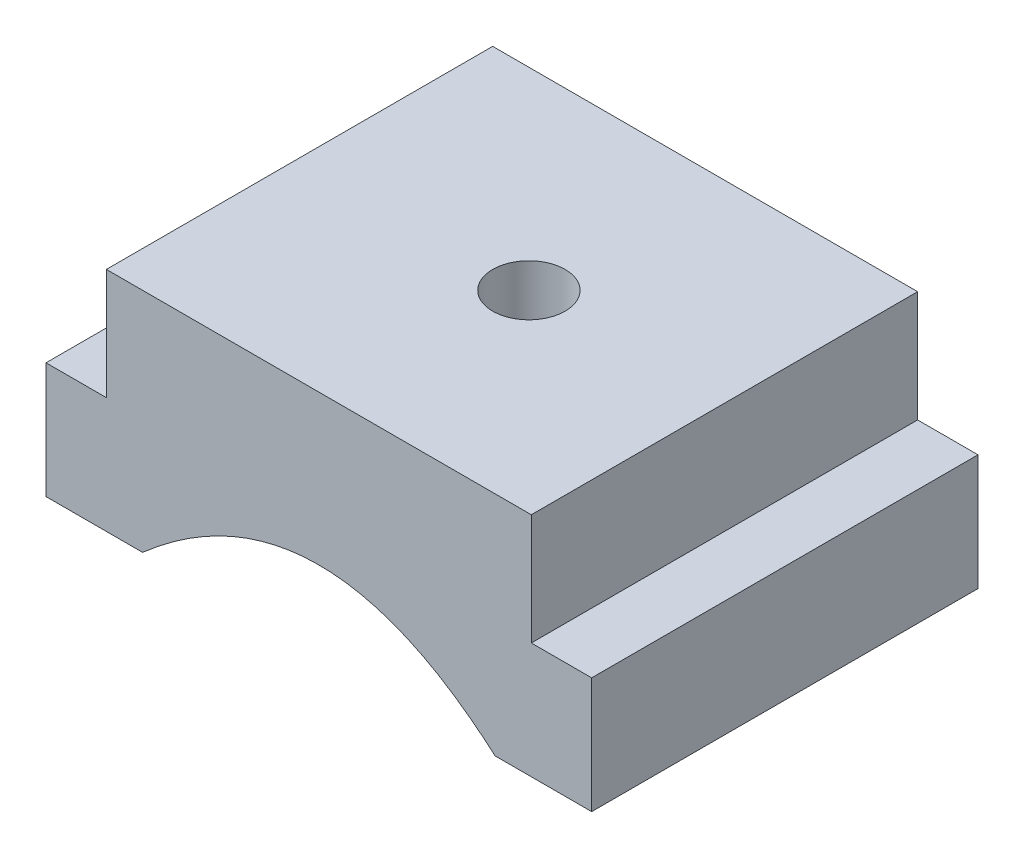
ISO-10303-21;
HEADER;
FILE_DESCRIPTION(('STEP AP214'),'2;1');
FILE_NAME('part.step','',(''),(''),'','','');
FILE_SCHEMA(('AUTOMOTIVE_DESIGN { 1 0 10303 214 1 1 1 1 }'));
ENDSEC;
DATA;
#1=APPLICATION_CONTEXT('core data for automotive mechanical design processes');
#2=APPLICATION_PROTOCOL_DEFINITION('international standard','automotive_design',2000,#1);
#3=PRODUCT_CONTEXT('',#1,'mechanical');
#4=PRODUCT('Part','Part','',(#3));
#5=PRODUCT_RELATED_PRODUCT_CATEGORY('part','',(#4));
#6=PRODUCT_DEFINITION_FORMATION('','',#4);
#7=PRODUCT_DEFINITION_CONTEXT('part definition',#1,'design');
#8=PRODUCT_DEFINITION('design','',#6,#7);
#9=PRODUCT_DEFINITION_SHAPE('','',#8);
#10=(LENGTH_UNIT() NAMED_UNIT(*) SI_UNIT(.MILLI.,.METRE.));
#11=(NAMED_UNIT(*) PLANE_ANGLE_UNIT() SI_UNIT($,.RADIAN.));
#12=(NAMED_UNIT(*) SI_UNIT($,.STERADIAN.) SOLID_ANGLE_UNIT());
#13=UNCERTAINTY_MEASURE_WITH_UNIT(LENGTH_MEASURE(1.E-05),#10,'distance_accuracy_value','');
#14=(GEOMETRIC_REPRESENTATION_CONTEXT(3) GLOBAL_UNCERTAINTY_ASSIGNED_CONTEXT((#13)) GLOBAL_UNIT_ASSIGNED_CONTEXT((#10,
#11,#12)) REPRESENTATION_CONTEXT('',''));
#15=CARTESIAN_POINT('',(0.,0.,0.));
#16=DIRECTION('',(0.,0.,1.));
#17=DIRECTION('',(1.,0.,0.));
#18=AXIS2_PLACEMENT_3D('',#15,#16,#17);
#19=CARTESIAN_POINT('',(-19.7972155270377,0.,80.));
#20=CARTESIAN_POINT('',(16.7027844729623,32.,80.));
#21=CARTESIAN_POINT('',(53.2027844729623,0.,80.));
#22=B_SPLINE_CURVE_WITH_KNOTS('',2,(#19,#20,#21),.UNSPECIFIED.,.F.,.F.,(3,3),(0.,1.),.UNSPECIFIED.);
#23=DIRECTION('',(0.,0.,-1.));
#24=VECTOR('',#23,1.);
#25=SURFACE_OF_LINEAR_EXTRUSION('',#22,#24);
#26=CARTESIAN_POINT('',(12.7027844729623,15.8078438731469,40.));
#27=CARTESIAN_POINT('',(12.7027811329601,15.8078424949188,40.2103642814895));
#28=CARTESIAN_POINT('',(12.7116373960897,15.8086969857389,40.420682640601));
#29=CARTESIAN_POINT('',(12.7469928365745,15.8120718795629,40.8398819532317));
#30=CARTESIAN_POINT('',(12.7734953414364,15.8145925967621,41.0487626281437));
#31=CARTESIAN_POINT('',(12.8439778497568,15.8211848594529,41.4636513455147));
#32=CARTESIAN_POINT('',(12.8879683309656,15.8252573346041,41.6696575890554));
#33=CARTESIAN_POINT('',(12.9931248011168,15.834760011879,42.0772881454137));
#34=CARTESIAN_POINT('',(13.0542970491031,15.8401907087019,42.2789108324801));
#35=CARTESIAN_POINT('',(13.1933062104572,15.8521404738558,42.6760874175447));
#36=CARTESIAN_POINT('',(13.2711279833806,15.8586585521851,42.8716466456621));
#37=CARTESIAN_POINT('',(13.442946083499,15.8724663645231,43.2555850280351));
#38=CARTESIAN_POINT('',(13.5369484549002,15.8797563864955,43.4439614669486));
#39=CARTESIAN_POINT('',(13.7403864220813,15.8947288660059,43.8120340019308));
#40=CARTESIAN_POINT('',(13.8498134131934,15.9024111032319,43.9917348631661));
#41=CARTESIAN_POINT('',(14.0834261064705,15.9177644533067,44.3413917224597));
#42=CARTESIAN_POINT('',(14.2076185061046,15.9254355594974,44.5113432460841));
#43=CARTESIAN_POINT('',(14.4702549513869,15.9403487632,44.8407238483631));
#44=CARTESIAN_POINT('',(14.6087412644471,15.9475894824547,45.0001192909669));
#45=CARTESIAN_POINT('',(14.8986117545956,15.9611598519759,45.3066207183838));
#46=CARTESIAN_POINT('',(15.0499900247875,15.9674899159533,45.4537322709444));
#47=CARTESIAN_POINT('',(15.3647010801389,15.9787943384368,45.7347600302563));
#48=CARTESIAN_POINT('',(15.5280389509402,15.9837681159053,45.8686705660117));
#49=CARTESIAN_POINT('',(15.8653888260099,15.9919198581393,46.122213953382));
#50=CARTESIAN_POINT('',(16.0393966948043,15.9950985138413,46.2418522843164));
#51=CARTESIAN_POINT('',(16.3964681168062,15.9992549429827,46.4657759865415));
#52=CARTESIAN_POINT('',(16.5795088820595,16.0002379917258,46.570097593544));
#53=CARTESIAN_POINT('',(16.9536424481939,15.9996642653355,46.7629394244298));
#54=CARTESIAN_POINT('',(17.1447321544833,15.998108457793,46.8514656538726));
#55=CARTESIAN_POINT('',(17.533663441858,15.9921631117613,47.0121372481301));
#56=CARTESIAN_POINT('',(17.7315058253688,15.9877732353795,47.0842806583125));
#57=CARTESIAN_POINT('',(18.1324707469589,15.9759346689487,47.2116606787279));
#58=CARTESIAN_POINT('',(18.3355932450713,15.9684860020463,47.2668974168926));
#59=CARTESIAN_POINT('',(18.7436379262728,15.9504734113169,47.359636045737));
#60=CARTESIAN_POINT('',(18.9485236485798,15.939940344982,47.3973044535959));
#61=CARTESIAN_POINT('',(19.3605301693099,15.915677361067,47.4554604175629));
#62=CARTESIAN_POINT('',(19.5676509511847,15.9019474671405,47.4759481007876));
#63=CARTESIAN_POINT('',(19.9826411918545,15.8713225757544,47.4996487684673));
#64=CARTESIAN_POINT('',(20.1905106408203,15.8544276197012,47.5028619788967));
#65=CARTESIAN_POINT('',(20.605529289532,15.8175915276261,47.4920549068459));
#66=CARTESIAN_POINT('',(20.8126784861573,15.7976503784234,47.4780345497946));
#67=CARTESIAN_POINT('',(21.224932962823,15.754913132887,47.4329156977198));
#68=CARTESIAN_POINT('',(21.4300369736911,15.7321153700269,47.4018071974625));
#69=CARTESIAN_POINT('',(21.836749391784,15.6839485279663,47.322778870896));
#70=CARTESIAN_POINT('',(22.0383564919358,15.6585785105729,47.2748528948554));
#71=CARTESIAN_POINT('',(22.4365929262962,15.6056365599327,47.1626033414258));
#72=CARTESIAN_POINT('',(22.6332236226905,15.5780652380231,47.0982843058459));
#73=CARTESIAN_POINT('',(23.0203479524912,15.5211214407745,46.9537073113719));
#74=CARTESIAN_POINT('',(23.2108392638403,15.4917482958613,46.8734434021081));
#75=CARTESIAN_POINT('',(23.5876987204099,15.4311469049892,46.6960061177129));
#76=CARTESIAN_POINT('',(23.7739337089655,15.3998949888119,46.5985579473927));
#77=CARTESIAN_POINT('',(24.137531071552,15.3365522908774,46.3884173635301));
#78=CARTESIAN_POINT('',(24.3148903241,15.3044612199579,46.275719637812));
#79=CARTESIAN_POINT('',(24.6594927766998,15.2400283326665,46.0358774957598));
#80=CARTESIAN_POINT('',(24.8267365315545,15.2076865301563,45.9087338728402));
#81=CARTESIAN_POINT('',(25.1500123510019,15.1433496598149,45.6408338515648));
#82=CARTESIAN_POINT('',(25.3060443856959,15.1113545929084,45.5000774169093));
#83=CARTESIAN_POINT('',(25.6081780238944,15.0478321030583,45.2035767706412));
#84=CARTESIAN_POINT('',(25.7540877932641,15.0163196575028,45.0476337591228));
#85=CARTESIAN_POINT('',(26.0321734545005,14.9549328882292,44.7237449939817));
#86=CARTESIAN_POINT('',(26.1643541971093,14.9250579877073,44.555803515301));
#87=CARTESIAN_POINT('',(26.4141091522427,14.8675492268599,44.2089350345718));
#88=CARTESIAN_POINT('',(26.5316783302649,14.8399161400971,44.0300042776558));
#89=CARTESIAN_POINT('',(26.7512065886302,14.7875100019174,43.6625072329745));
#90=CARTESIAN_POINT('',(26.8531719900073,14.7627357933848,43.47394488844));
#91=CARTESIAN_POINT('',(27.0396898279031,14.7168413535121,43.0905761613306));
#92=CARTESIAN_POINT('',(27.1244224051579,14.6956837343025,42.8958619213895));
#93=CARTESIAN_POINT('',(27.2771438565377,14.6571740429586,42.4996972846669));
#94=CARTESIAN_POINT('',(27.3451395608028,14.639820418772,42.2982496739493));
#95=CARTESIAN_POINT('',(27.4638493602999,14.609306176785,41.8900068867986));
#96=CARTESIAN_POINT('',(27.5145630137331,14.596145666178,41.6832115738022));
#97=CARTESIAN_POINT('',(27.5982543472083,14.5743275408087,41.2658296363432));
#98=CARTESIAN_POINT('',(27.6312324636264,14.5656698152574,41.055243105294));
#99=CARTESIAN_POINT('',(27.6784410499476,14.5532505298508,40.6381874345302));
#100=CARTESIAN_POINT('',(27.6931997877674,14.5493510465688,40.4317820409567));
#101=CARTESIAN_POINT('',(27.7056114567703,14.5460727444367,40.0184238843302));
#102=CARTESIAN_POINT('',(27.7032647473286,14.5466938306121,39.8114711328682));
#103=CARTESIAN_POINT('',(27.6814873650233,14.5524422614836,39.3985467997933));
#104=CARTESIAN_POINT('',(27.6620580131715,14.5575692577348,39.19257514355));
#105=CARTESIAN_POINT('',(27.6062860264161,14.5722130816513,38.7830937285978));
#106=CARTESIAN_POINT('',(27.5699434131895,14.5817299036904,38.5795839667339));
#107=CARTESIAN_POINT('',(27.4812330418919,14.6047901999282,38.1790910352971));
#108=CARTESIAN_POINT('',(27.4290783155658,14.6182800812371,37.9820575192627));
#109=CARTESIAN_POINT('',(27.3089935177491,14.6490455442132,37.5930853091826));
#110=CARTESIAN_POINT('',(27.2410577479309,14.6663224932136,37.4011484834481));
#111=CARTESIAN_POINT('',(27.0899752683108,14.7042908507979,37.0237774875081));
#112=CARTESIAN_POINT('',(27.0068330672746,14.7249812471039,36.8383414091762));
#113=CARTESIAN_POINT('',(26.8259157374457,14.769364847205,36.4750420288723));
#114=CARTESIAN_POINT('',(26.7281351293961,14.7930591748817,36.2971815946742));
#115=CARTESIAN_POINT('',(26.5166741048115,14.8434477785422,35.9469223483857));
#116=CARTESIAN_POINT('',(26.4027267329565,14.8701905270753,35.774691673005));
#117=CARTESIAN_POINT('',(26.1611655979371,14.9257705617812,35.4403682319887));
#118=CARTESIAN_POINT('',(26.0335470986637,14.9546085726983,35.278279010677));
#119=CARTESIAN_POINT('',(25.7655571177969,15.0138079272194,34.96532031904));
#120=CARTESIAN_POINT('',(25.625186038616,15.044169222742,34.8144504949553));
#121=CARTESIAN_POINT('',(25.332618348677,15.1058418473375,34.5248587586622));
#122=CARTESIAN_POINT('',(25.1804215027262,15.1371531952976,34.3861370881747));
#123=CARTESIAN_POINT('',(24.8606706768299,15.201052917285,34.1179189932776));
#124=CARTESIAN_POINT('',(24.6928017997786,15.2336521893521,33.9888003289642));
#125=CARTESIAN_POINT('',(24.3467799073316,15.2986211526853,33.74523767681));
#126=CARTESIAN_POINT('',(24.1686302756866,15.3309909155964,33.6307889001037));
#127=CARTESIAN_POINT('',(23.8031089323577,15.3949340017715,33.4172588311747));
#128=CARTESIAN_POINT('',(23.6157334594598,15.4265069921374,33.3181838760798));
#129=CARTESIAN_POINT('',(23.2331572532774,15.4882738666127,33.1362041179635));
#130=CARTESIAN_POINT('',(23.0379595099387,15.5184682684018,33.0532932062264));
#131=CARTESIAN_POINT('',(22.6396908101356,15.5771730623147,32.9037313291627));
#132=CARTESIAN_POINT('',(22.436576596335,15.60567110439,32.8371906268234));
#133=CARTESIAN_POINT('',(22.0251921390094,15.6602951705684,32.7216444867941));
#134=CARTESIAN_POINT('',(21.8169239103995,15.6864221035581,32.6726323087561));
#135=CARTESIAN_POINT('',(21.3966219123967,15.7359300950981,32.5925359698));
#136=CARTESIAN_POINT('',(21.1845877594598,15.759310872096,32.5614536458826));
#137=CARTESIAN_POINT('',(20.7583261707279,15.803015962176,32.5175353160058));
#138=CARTESIAN_POINT('',(20.5440987747483,15.8233403306384,32.5046989794037));
#139=CARTESIAN_POINT('',(20.1189079562006,15.8603803618739,32.4975098286251));
#140=CARTESIAN_POINT('',(19.9079551297945,15.8771543561273,32.5028287213462));
#141=CARTESIAN_POINT('',(19.487015148954,15.9074330511877,32.5312536544671));
#142=CARTESIAN_POINT('',(19.2770279840481,15.9209377875286,32.5543595015277));
#143=CARTESIAN_POINT('',(18.8595861432914,15.9446562765961,32.6182387020883));
#144=CARTESIAN_POINT('',(18.6521312784474,15.9548702763831,32.6590107287162));
#145=CARTESIAN_POINT('',(18.2412792321412,15.9720801381479,32.7579599863541));
#146=CARTESIAN_POINT('',(18.037882019204,15.9790760250976,32.8161370822981));
#147=CARTESIAN_POINT('',(17.6397974204533,15.989923928505,32.9484468120137));
#148=CARTESIAN_POINT('',(17.4450235495525,15.99382342416,33.022315546985));
#149=CARTESIAN_POINT('',(17.0621945709314,15.9988888692068,33.1860399700168));
#150=CARTESIAN_POINT('',(16.8741419290476,16.0000538253048,33.2759014545349));
#151=CARTESIAN_POINT('',(16.5062060831699,15.9999423550122,33.4709377589115));
#152=CARTESIAN_POINT('',(16.3263211675799,15.9986664425601,33.576109350834));
#153=CARTESIAN_POINT('',(15.9759377088458,15.9940238596743,33.8010397066243));
#154=CARTESIAN_POINT('',(15.8054394445297,15.9906571271697,33.9207989034741));
#155=CARTESIAN_POINT('',(15.4745566933548,15.9822124723063,34.1744154509246));
#156=CARTESIAN_POINT('',(15.3142019518769,15.9771297712376,34.3083114467212));
#157=CARTESIAN_POINT('',(15.0052416111069,15.9656787414096,34.5889828128028));
#158=CARTESIAN_POINT('',(14.856636025946,15.959310411104,34.7357581985781));
#159=CARTESIAN_POINT('',(14.5721645834227,15.9457243112159,35.041201310069));
#160=CARTESIAN_POINT('',(14.4363016677954,15.9385063463523,35.199871766708));
#161=CARTESIAN_POINT('',(14.1782900263213,15.9236608863945,35.5279733894957));
#162=CARTESIAN_POINT('',(14.0561410962457,15.9160333974015,35.6974043953393));
#163=CARTESIAN_POINT('',(13.8252597251643,15.9007191216921,36.0475839754377));
#164=CARTESIAN_POINT('',(13.7166716579659,15.8930324930632,36.2284277756925));
#165=CARTESIAN_POINT('',(13.5151381988678,15.8780897360228,36.5985622936026));
#166=CARTESIAN_POINT('',(13.4221872553076,15.8708334554194,36.7878499830927));
#167=CARTESIAN_POINT('',(13.2525906711201,15.8571242236489,37.173493046557));
#168=CARTESIAN_POINT('',(13.1759352117864,15.8506707897113,37.3698440806961));
#169=CARTESIAN_POINT('',(13.0394244240524,15.8388823127032,37.7682674251934));
#170=CARTESIAN_POINT('',(12.9795658656767,15.8335470546621,37.9703386273477));
#171=CARTESIAN_POINT('',(12.8535436681004,15.8221240793875,38.4725967874067));
#172=CARTESIAN_POINT('',(12.7970740355187,15.8168130590897,38.7752876499824));
#173=CARTESIAN_POINT('',(12.7216969890722,15.8096739729105,39.3853516867973));
#174=CARTESIAN_POINT('',(12.7027893516408,15.8078458862989,39.692724833157));
#175=CARTESIAN_POINT('',(12.7027844729623,15.8078438731469,40.));
#176=B_SPLINE_CURVE_WITH_KNOTS('',3,(#26,#27,#28,#29,#30,#31,#32,#33,#34,#35,#36,#37,#38,#39,
#40,#41,#42,#43,#44,#45,#46,#47,#48,#49,#50,#51,#52,#53,#54,#55,#56,#57,#58,#59,#60,#61,#62,#63,
#64,#65,#66,#67,#68,#69,#70,#71,#72,#73,#74,#75,#76,#77,#78,#79,#80,#81,#82,#83,#84,#85,#86,#87,
#88,#89,#90,#91,#92,#93,#94,#95,#96,#97,#98,#99,#100,#101,#102,#103,#104,#105,#106,#107,#108,
#109,#110,#111,#112,#113,#114,#115,#116,#117,#118,#119,#120,#121,#122,#123,#124,#125,#126,#127,
#128,#129,#130,#131,#132,#133,#134,#135,#136,#137,#138,#139,#140,#141,#142,#143,#144,#145,#146,
#147,#148,#149,#150,#151,#152,#153,#154,#155,#156,#157,#158,#159,#160,#161,#162,#163,#164,#165,
#166,#167,#168,#169,#170,#171,#172,#173,#174,#175),.UNSPECIFIED.,.T.,.F.,(4,2,2,2,2,2,2,2,2,2,2,
2,2,2,2,2,2,2,2,2,2,2,2,2,2,2,2,2,2,2,2,2,2,2,2,2,2,2,2,2,2,2,2,2,2,2,2,2,2,2,2,2,2,2,2,2,2,2,2,
2,2,2,2,2,2,2,2,2,2,2,2,2,2,2,4),(0.,0.630825727629168,1.26177044215017,1.89309375214709,
2.52464734210852,3.15562904399144,3.78684696043172,4.41771413357743,5.04886856258194,
5.68194591684066,6.31473474948758,6.9477942466179,7.58060991490426,8.21190349728554,
8.8429565417175,9.47408483750551,10.1052083574708,10.7302218568345,11.3552307318078,
11.9802314307607,12.6052348341535,13.2306045723129,13.8562032313015,14.4816287519666,
15.107288111289,15.7440502684994,16.3810348153169,17.0179843938183,17.6549356708466,
18.3017780508231,18.9483911052872,19.5952263400985,20.2417988466493,20.8812191470781,
21.5203780726394,22.1595533364532,22.7987128728866,23.4188683363479,24.0390107707531,
24.6591052533605,25.2791989412167,25.8912839307593,26.5035902806649,27.115715372829,
27.7280701631761,28.3520676240286,28.9762819606379,29.6004766067627,30.2246836701387,
30.866759394859,31.5086249824632,32.1507544498416,32.7926407712053,33.4387389688679,
34.0845884507189,34.7305040912402,35.3764080267228,36.0106946991059,36.6449744770657,
37.2792066237719,37.9134338488644,38.5377373533027,39.1622675946129,39.7866663520857,
40.4110836471662,41.0372543927546,41.6634258914518,42.2897415922618,42.9160479647379,
43.5485381055923,44.1808032168902,44.8126862755438,45.4444477422674,46.3658885545994,
47.2873238825632),.UNSPECIFIED.);
#177=CARTESIAN_POINT('',(12.7027844729623,15.8078438731469,40.));
#178=VERTEX_POINT('',#177);
#179=EDGE_CURVE('E156',#178,#178,#176,.T.);
#180=ORIENTED_EDGE('',*,*,#179,.T.);
#181=EDGE_LOOP('',(#180));
#182=FACE_BOUND('',#181,.T.);
#183=CARTESIAN_POINT('',(-19.7972155270377,0.,0.));
#184=CARTESIAN_POINT('',(16.7027844729623,32.,0.));
#185=CARTESIAN_POINT('',(53.2027844729623,0.,0.));
#186=B_SPLINE_CURVE_WITH_KNOTS('',2,(#183,#184,#185),.UNSPECIFIED.,.F.,.F.,(3,3),(0.,1.),.UNSPECIFIED.);
#187=CARTESIAN_POINT('',(-19.7972155270377,0.,0.));
#188=VERTEX_POINT('',#187);
#189=CARTESIAN_POINT('',(53.2027844729623,0.,0.));
#190=VERTEX_POINT('',#189);
#191=EDGE_CURVE('E150',#188,#190,#186,.T.);
#192=ORIENTED_EDGE('',*,*,#191,.T.);
#193=DIRECTION('',(0.,0.,-1.));
#194=VECTOR('',#193,1.);
#195=CARTESIAN_POINT('',(53.2027844729623,0.,80.));
#196=LINE('',#195,#194);
#197=CARTESIAN_POINT('',(53.2027844729623,0.,80.));
#198=VERTEX_POINT('',#197);
#199=EDGE_CURVE('E11',#198,#190,#196,.T.);
#200=ORIENTED_EDGE('',*,*,#199,.F.);
#201=CARTESIAN_POINT('',(-19.7972155270377,0.,80.));
#202=VERTEX_POINT('',#201);
#203=EDGE_CURVE('E174',#202,#198,#22,.T.);
#204=ORIENTED_EDGE('',*,*,#203,.F.);
#205=DIRECTION('',(0.,0.,-1.));
#206=VECTOR('',#205,1.);
#207=CARTESIAN_POINT('',(-19.7972155270377,0.,80.));
#208=LINE('',#207,#206);
#209=EDGE_CURVE('E146',#202,#188,#208,.T.);
#210=ORIENTED_EDGE('',*,*,#209,.T.);
#211=EDGE_LOOP('',(#192,#200,#204,#210));
#212=FACE_BOUND('',#211,.T.);
#213=ADVANCED_FACE('F40',(#182,#212),#25,.F.);
#214=CARTESIAN_POINT('',(73.2027844729623,0.,80.));
#215=DIRECTION('',(0.,1.,0.));
#216=DIRECTION('',(0.,0.,1.));
#217=AXIS2_PLACEMENT_3D('',#214,#215,#216);
#218=PLANE('',#217);
#219=DIRECTION('',(1.,0.,0.));
#220=VECTOR('',#219,1.);
#221=CARTESIAN_POINT('',(73.2027844729623,0.,0.));
#222=LINE('',#221,#220);
#223=CARTESIAN_POINT('',(73.2027844729623,0.,0.));
#224=VERTEX_POINT('',#223);
#225=EDGE_CURVE('E155',#190,#224,#222,.T.);
#226=ORIENTED_EDGE('',*,*,#225,.T.);
#227=DIRECTION('',(0.,0.,-1.));
#228=VECTOR('',#227,1.);
#229=CARTESIAN_POINT('',(73.2027844729623,0.,80.));
#230=LINE('',#229,#228);
#231=CARTESIAN_POINT('',(73.2027844729623,0.,80.));
#232=VERTEX_POINT('',#231);
#233=EDGE_CURVE('E50',#232,#224,#230,.T.);
#234=ORIENTED_EDGE('',*,*,#233,.F.);
#235=DIRECTION('',(1.,0.,0.));
#236=VECTOR('',#235,1.);
#237=CARTESIAN_POINT('',(73.2027844729623,0.,80.));
#238=LINE('',#237,#236);
#239=EDGE_CURVE('E107',#198,#232,#238,.T.);
#240=ORIENTED_EDGE('',*,*,#239,.F.);
#241=ORIENTED_EDGE('',*,*,#199,.T.);
#242=EDGE_LOOP('',(#226,#234,#240,#241));
#243=FACE_BOUND('',#242,.T.);
#244=ADVANCED_FACE('F262',(#243),#218,.F.);
#245=CARTESIAN_POINT('',(73.2027844729623,0.,80.));
#246=DIRECTION('',(-1.,0.,0.));
#247=DIRECTION('',(0.,0.,1.));
#248=AXIS2_PLACEMENT_3D('',#245,#246,#247);
#249=PLANE('',#248);
#250=DIRECTION('',(0.,1.,0.));
#251=VECTOR('',#250,1.);
#252=CARTESIAN_POINT('',(73.2027844729623,0.,0.));
#253=LINE('',#252,#251);
#254=CARTESIAN_POINT('',(73.2027844729623,24.,0.));
#255=VERTEX_POINT('',#254);
#256=EDGE_CURVE('E161',#224,#255,#253,.T.);
#257=ORIENTED_EDGE('',*,*,#256,.T.);
#258=DIRECTION('',(0.,0.,-1.));
#259=VECTOR('',#258,1.);
#260=CARTESIAN_POINT('',(73.2027844729623,24.,80.));
#261=LINE('',#260,#259);
#262=CARTESIAN_POINT('',(73.2027844729623,24.,80.));
#263=VERTEX_POINT('',#262);
#264=EDGE_CURVE('E187',#263,#255,#261,.T.);
#265=ORIENTED_EDGE('',*,*,#264,.F.);
#266=DIRECTION('',(0.,1.,0.));
#267=VECTOR('',#266,1.);
#268=CARTESIAN_POINT('',(73.2027844729623,0.,80.));
#269=LINE('',#268,#267);
#270=EDGE_CURVE('E195',#232,#263,#269,.T.);
#271=ORIENTED_EDGE('',*,*,#270,.F.);
#272=ORIENTED_EDGE('',*,*,#233,.T.);
#273=EDGE_LOOP('',(#257,#265,#271,#272));
#274=FACE_BOUND('',#273,.T.);
#275=ADVANCED_FACE('F193',(#274),#249,.F.);
#276=CARTESIAN_POINT('',(73.2027844729623,24.,80.));
#277=DIRECTION('',(0.,-1.,0.));
#278=DIRECTION('',(0.,0.,-1.));
#279=AXIS2_PLACEMENT_3D('',#276,#277,#278);
#280=PLANE('',#279);
#281=DIRECTION('',(-1.,0.,0.));
#282=VECTOR('',#281,1.);
#283=CARTESIAN_POINT('',(73.2027844729623,24.,0.));
#284=LINE('',#283,#282);
#285=CARTESIAN_POINT('',(60.7027844729623,24.,0.));
#286=VERTEX_POINT('',#285);
#287=EDGE_CURVE('E163',#255,#286,#284,.T.);
#288=ORIENTED_EDGE('',*,*,#287,.T.);
#289=DIRECTION('',(0.,0.,-1.));
#290=VECTOR('',#289,1.);
#291=CARTESIAN_POINT('',(60.7027844729623,24.,80.));
#292=LINE('',#291,#290);
#293=CARTESIAN_POINT('',(60.7027844729623,24.,80.));
#294=VERTEX_POINT('',#293);
#295=EDGE_CURVE('E184',#294,#286,#292,.T.);
#296=ORIENTED_EDGE('',*,*,#295,.F.);
#297=DIRECTION('',(-1.,0.,0.));
#298=VECTOR('',#297,1.);
#299=CARTESIAN_POINT('',(73.2027844729623,24.,80.));
#300=LINE('',#299,#298);
#301=EDGE_CURVE('E213',#263,#294,#300,.T.);
#302=ORIENTED_EDGE('',*,*,#301,.F.);
#303=ORIENTED_EDGE('',*,*,#264,.T.);
#304=EDGE_LOOP('',(#288,#296,#302,#303));
#305=FACE_BOUND('',#304,.T.);
#306=ADVANCED_FACE('F204',(#305),#280,.F.);
#307=CARTESIAN_POINT('',(60.7027844729623,24.,80.));
#308=DIRECTION('',(-1.,0.,0.));
#309=DIRECTION('',(0.,0.,1.));
#310=AXIS2_PLACEMENT_3D('',#307,#308,#309);
#311=PLANE('',#310);
#312=DIRECTION('',(0.,1.,0.));
#313=VECTOR('',#312,1.);
#314=CARTESIAN_POINT('',(60.7027844729623,24.,0.));
#315=LINE('',#314,#313);
#316=CARTESIAN_POINT('',(60.7027844729623,47.,0.));
#317=VERTEX_POINT('',#316);
#318=EDGE_CURVE('E165',#286,#317,#315,.T.);
#319=ORIENTED_EDGE('',*,*,#318,.T.);
#320=DIRECTION('',(0.,0.,-1.));
#321=VECTOR('',#320,1.);
#322=CARTESIAN_POINT('',(60.7027844729623,47.,80.));
#323=LINE('',#322,#321);
#324=CARTESIAN_POINT('',(60.7027844729623,47.,80.));
#325=VERTEX_POINT('',#324);
#326=EDGE_CURVE('E181',#325,#317,#323,.T.);
#327=ORIENTED_EDGE('',*,*,#326,.F.);
#328=DIRECTION('',(0.,1.,0.));
#329=VECTOR('',#328,1.);
#330=CARTESIAN_POINT('',(60.7027844729623,24.,80.));
#331=LINE('',#330,#329);
#332=EDGE_CURVE('E210',#294,#325,#331,.T.);
#333=ORIENTED_EDGE('',*,*,#332,.F.);
#334=ORIENTED_EDGE('',*,*,#295,.T.);
#335=EDGE_LOOP('',(#319,#327,#333,#334));
#336=FACE_BOUND('',#335,.T.);
#337=ADVANCED_FACE('F208',(#336),#311,.F.);
#338=CARTESIAN_POINT('',(60.7027844729623,47.,80.));
#339=DIRECTION('',(0.,-1.,0.));
#340=DIRECTION('',(0.,0.,-1.));
#341=AXIS2_PLACEMENT_3D('',#338,#339,#340);
#342=PLANE('',#341);
#343=CARTESIAN_POINT('',(20.2027844729623,47.,40.));
#344=DIRECTION('',(0.,1.,0.));
#345=DIRECTION('',(-1.,0.,0.));
#346=AXIS2_PLACEMENT_3D('',#343,#344,#345);
#347=CIRCLE('',#346,7.5);
#348=CARTESIAN_POINT('',(12.7027844729623,47.,40.));
#349=VERTEX_POINT('',#348);
#350=EDGE_CURVE('E232',#349,#349,#347,.T.);
#351=ORIENTED_EDGE('',*,*,#350,.F.);
#352=EDGE_LOOP('',(#351));
#353=FACE_BOUND('',#352,.T.);
#354=DIRECTION('',(-1.,0.,0.));
#355=VECTOR('',#354,1.);
#356=CARTESIAN_POINT('',(60.7027844729623,47.,0.));
#357=LINE('',#356,#355);
#358=CARTESIAN_POINT('',(-27.2972155270377,47.,0.));
#359=VERTEX_POINT('',#358);
#360=EDGE_CURVE('E167',#317,#359,#357,.T.);
#361=ORIENTED_EDGE('',*,*,#360,.T.);
#362=DIRECTION('',(0.,0.,-1.));
#363=VECTOR('',#362,1.);
#364=CARTESIAN_POINT('',(-27.2972155270377,47.,80.));
#365=LINE('',#364,#363);
#366=CARTESIAN_POINT('',(-27.2972155270377,47.,80.));
#367=VERTEX_POINT('',#366);
#368=EDGE_CURVE('E178',#367,#359,#365,.T.);
#369=ORIENTED_EDGE('',*,*,#368,.F.);
#370=DIRECTION('',(-1.,0.,0.));
#371=VECTOR('',#370,1.);
#372=CARTESIAN_POINT('',(60.7027844729623,47.,80.));
#373=LINE('',#372,#371);
#374=EDGE_CURVE('E212',#325,#367,#373,.T.);
#375=ORIENTED_EDGE('',*,*,#374,.F.);
#376=ORIENTED_EDGE('',*,*,#326,.T.);
#377=EDGE_LOOP('',(#361,#369,#375,#376));
#378=FACE_BOUND('',#377,.T.);
#379=ADVANCED_FACE('F252',(#353,#378),#342,.F.);
#380=CARTESIAN_POINT('',(-27.2972155270377,47.,80.));
#381=DIRECTION('',(1.,0.,0.));
#382=DIRECTION('',(0.,1.,0.));
#383=AXIS2_PLACEMENT_3D('',#380,#381,#382);
#384=PLANE('',#383);
#385=DIRECTION('',(0.,-1.,0.));
#386=VECTOR('',#385,1.);
#387=CARTESIAN_POINT('',(-27.2972155270377,47.,0.));
#388=LINE('',#387,#386);
#389=CARTESIAN_POINT('',(-27.2972155270377,24.,0.));
#390=VERTEX_POINT('',#389);
#391=EDGE_CURVE('E169',#359,#390,#388,.T.);
#392=ORIENTED_EDGE('',*,*,#391,.T.);
#393=DIRECTION('',(0.,0.,-1.));
#394=VECTOR('',#393,1.);
#395=CARTESIAN_POINT('',(-27.2972155270377,24.,80.));
#396=LINE('',#395,#394);
#397=CARTESIAN_POINT('',(-27.2972155270377,24.,80.));
#398=VERTEX_POINT('',#397);
#399=EDGE_CURVE('E141',#398,#390,#396,.T.);
#400=ORIENTED_EDGE('',*,*,#399,.F.);
#401=DIRECTION('',(0.,-1.,0.));
#402=VECTOR('',#401,1.);
#403=CARTESIAN_POINT('',(-27.2972155270377,47.,80.));
#404=LINE('',#403,#402);
#405=EDGE_CURVE('E132',#367,#398,#404,.T.);
#406=ORIENTED_EDGE('',*,*,#405,.F.);
#407=ORIENTED_EDGE('',*,*,#368,.T.);
#408=EDGE_LOOP('',(#392,#400,#406,#407));
#409=FACE_BOUND('',#408,.T.);
#410=ADVANCED_FACE('F249',(#409),#384,.F.);
#411=CARTESIAN_POINT('',(-27.2972155270377,24.,80.));
#412=DIRECTION('',(0.,-1.,0.));
#413=DIRECTION('',(1.,0.,0.));
#414=AXIS2_PLACEMENT_3D('',#411,#412,#413);
#415=PLANE('',#414);
#416=DIRECTION('',(-1.,0.,0.));
#417=VECTOR('',#416,1.);
#418=CARTESIAN_POINT('',(-27.2972155270377,24.,0.));
#419=LINE('',#418,#417);
#420=CARTESIAN_POINT('',(-39.7972155270377,24.,0.));
#421=VERTEX_POINT('',#420);
#422=EDGE_CURVE('E140',#390,#421,#419,.T.);
#423=ORIENTED_EDGE('',*,*,#422,.T.);
#424=DIRECTION('',(0.,0.,-1.));
#425=VECTOR('',#424,1.);
#426=CARTESIAN_POINT('',(-39.7972155270377,24.,80.));
#427=LINE('',#426,#425);
#428=CARTESIAN_POINT('',(-39.7972155270377,24.,80.));
#429=VERTEX_POINT('',#428);
#430=EDGE_CURVE('E137',#429,#421,#427,.T.);
#431=ORIENTED_EDGE('',*,*,#430,.F.);
#432=DIRECTION('',(-1.,0.,0.));
#433=VECTOR('',#432,1.);
#434=CARTESIAN_POINT('',(-27.2972155270377,24.,80.));
#435=LINE('',#434,#433);
#436=EDGE_CURVE('E126',#398,#429,#435,.T.);
#437=ORIENTED_EDGE('',*,*,#436,.F.);
#438=ORIENTED_EDGE('',*,*,#399,.T.);
#439=EDGE_LOOP('',(#423,#431,#437,#438));
#440=FACE_BOUND('',#439,.T.);
#441=ADVANCED_FACE('F138',(#440),#415,.F.);
#442=CARTESIAN_POINT('',(-39.7972155270377,24.,80.));
#443=DIRECTION('',(1.,0.,0.));
#444=DIRECTION('',(0.,0.,-1.));
#445=AXIS2_PLACEMENT_3D('',#442,#443,#444);
#446=PLANE('',#445);
#447=DIRECTION('',(0.,-1.,0.));
#448=VECTOR('',#447,1.);
#449=CARTESIAN_POINT('',(-39.7972155270377,24.,0.));
#450=LINE('',#449,#448);
#451=CARTESIAN_POINT('',(-39.7972155270377,0.,0.));
#452=VERTEX_POINT('',#451);
#453=EDGE_CURVE('E93',#421,#452,#450,.T.);
#454=ORIENTED_EDGE('',*,*,#453,.T.);
#455=DIRECTION('',(0.,0.,-1.));
#456=VECTOR('',#455,1.);
#457=CARTESIAN_POINT('',(-39.7972155270377,0.,80.));
#458=LINE('',#457,#456);
#459=CARTESIAN_POINT('',(-39.7972155270377,0.,80.));
#460=VERTEX_POINT('',#459);
#461=EDGE_CURVE('E142',#460,#452,#458,.T.);
#462=ORIENTED_EDGE('',*,*,#461,.F.);
#463=DIRECTION('',(0.,-1.,0.));
#464=VECTOR('',#463,1.);
#465=CARTESIAN_POINT('',(-39.7972155270377,24.,80.));
#466=LINE('',#465,#464);
#467=EDGE_CURVE('E130',#429,#460,#466,.T.);
#468=ORIENTED_EDGE('',*,*,#467,.F.);
#469=ORIENTED_EDGE('',*,*,#430,.T.);
#470=EDGE_LOOP('',(#454,#462,#468,#469));
#471=FACE_BOUND('',#470,.T.);
#472=ADVANCED_FACE('F144',(#471),#446,.F.);
#473=CARTESIAN_POINT('',(-39.7972155270377,0.,80.));
#474=DIRECTION('',(0.,1.,0.));
#475=DIRECTION('',(0.,0.,1.));
#476=AXIS2_PLACEMENT_3D('',#473,#474,#475);
#477=PLANE('',#476);
#478=DIRECTION('',(1.,0.,0.));
#479=VECTOR('',#478,1.);
#480=CARTESIAN_POINT('',(-39.7972155270377,0.,0.));
#481=LINE('',#480,#479);
#482=EDGE_CURVE('E99',#452,#188,#481,.T.);
#483=ORIENTED_EDGE('',*,*,#482,.T.);
#484=ORIENTED_EDGE('',*,*,#209,.F.);
#485=DIRECTION('',(1.,0.,0.));
#486=VECTOR('',#485,1.);
#487=CARTESIAN_POINT('',(-39.7972155270377,0.,80.));
#488=LINE('',#487,#486);
#489=EDGE_CURVE('E58',#460,#202,#488,.T.);
#490=ORIENTED_EDGE('',*,*,#489,.F.);
#491=ORIENTED_EDGE('',*,*,#461,.T.);
#492=EDGE_LOOP('',(#483,#484,#490,#491));
#493=FACE_BOUND('',#492,.T.);
#494=ADVANCED_FACE('F240',(#493),#477,.F.);
#495=CARTESIAN_POINT('',(16.7027844729623,16.,80.));
#496=DIRECTION('',(0.,0.,1.));
#497=DIRECTION('',(1.,0.,0.));
#498=AXIS2_PLACEMENT_3D('',#495,#496,#497);
#499=PLANE('',#498);
#500=ORIENTED_EDGE('',*,*,#203,.T.);
#501=ORIENTED_EDGE('',*,*,#239,.T.);
#502=ORIENTED_EDGE('',*,*,#270,.T.);
#503=ORIENTED_EDGE('',*,*,#301,.T.);
#504=ORIENTED_EDGE('',*,*,#332,.T.);
#505=ORIENTED_EDGE('',*,*,#374,.T.);
#506=ORIENTED_EDGE('',*,*,#405,.T.);
#507=ORIENTED_EDGE('',*,*,#436,.T.);
#508=ORIENTED_EDGE('',*,*,#467,.T.);
#509=ORIENTED_EDGE('',*,*,#489,.T.);
#510=EDGE_LOOP('',(#500,#501,#502,#503,#504,#505,#506,#507,#508,#509));
#511=FACE_BOUND('',#510,.T.);
#512=ADVANCED_FACE('F128',(#511),#499,.T.);
#513=CARTESIAN_POINT('',(16.7027844729623,16.,0.));
#514=DIRECTION('',(0.,0.,1.));
#515=DIRECTION('',(1.,0.,0.));
#516=AXIS2_PLACEMENT_3D('',#513,#514,#515);
#517=PLANE('',#516);
#518=ORIENTED_EDGE('',*,*,#191,.F.);
#519=ORIENTED_EDGE('',*,*,#482,.F.);
#520=ORIENTED_EDGE('',*,*,#453,.F.);
#521=ORIENTED_EDGE('',*,*,#422,.F.);
#522=ORIENTED_EDGE('',*,*,#391,.F.);
#523=ORIENTED_EDGE('',*,*,#360,.F.);
#524=ORIENTED_EDGE('',*,*,#318,.F.);
#525=ORIENTED_EDGE('',*,*,#287,.F.);
#526=ORIENTED_EDGE('',*,*,#256,.F.);
#527=ORIENTED_EDGE('',*,*,#225,.F.);
#528=EDGE_LOOP('',(#518,#519,#520,#521,#522,#523,#524,#525,#526,#527));
#529=FACE_BOUND('',#528,.T.);
#530=ADVANCED_FACE('F199',(#529),#517,.F.);
#531=CARTESIAN_POINT('',(20.2027844729623,0.,40.));
#532=DIRECTION('',(0.,1.,0.));
#533=DIRECTION('',(-1.,0.,0.));
#534=AXIS2_PLACEMENT_3D('',#531,#532,#533);
#535=CYLINDRICAL_SURFACE('',#534,7.5);
#536=ORIENTED_EDGE('',*,*,#350,.T.);
#537=EDGE_LOOP('',(#536));
#538=FACE_BOUND('',#537,.T.);
#539=ORIENTED_EDGE('',*,*,#179,.F.);
#540=EDGE_LOOP('',(#539));
#541=FACE_BOUND('',#540,.T.);
#542=ADVANCED_FACE('F233',(#538,#541),#535,.F.);
#543=CLOSED_SHELL('',(#213,#244,#275,#306,#337,#379,#410,#441,#472,#494,#512,#530,#542));
#544=MANIFOLD_SOLID_BREP('B2',#543);
#545=ADVANCED_BREP_SHAPE_REPRESENTATION('',(#18,#544),#14);
#546=SHAPE_DEFINITION_REPRESENTATION(#9,#545);
ENDSEC;
END-ISO-10303-21;
